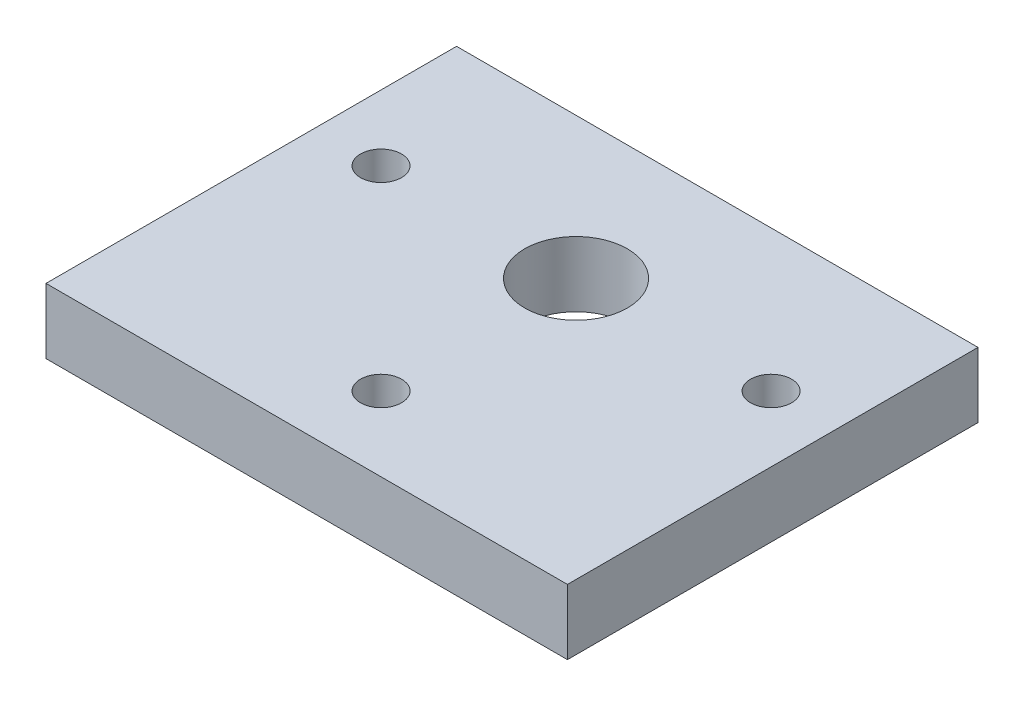
ISO-10303-21;
HEADER;
FILE_DESCRIPTION(('STEP AP214'),'2;1');
FILE_NAME('part.step','',(''),(''),'','','');
FILE_SCHEMA(('AUTOMOTIVE_DESIGN { 1 0 10303 214 1 1 1 1 }'));
ENDSEC;
DATA;
#1=APPLICATION_CONTEXT('core data for automotive mechanical design processes');
#2=APPLICATION_PROTOCOL_DEFINITION('international standard','automotive_design',2000,#1);
#3=PRODUCT_CONTEXT('',#1,'mechanical');
#4=PRODUCT('Part','Part','',(#3));
#5=PRODUCT_RELATED_PRODUCT_CATEGORY('part','',(#4));
#6=PRODUCT_DEFINITION_FORMATION('','',#4);
#7=PRODUCT_DEFINITION_CONTEXT('part definition',#1,'design');
#8=PRODUCT_DEFINITION('design','',#6,#7);
#9=PRODUCT_DEFINITION_SHAPE('','',#8);
#10=(LENGTH_UNIT() NAMED_UNIT(*) SI_UNIT(.MILLI.,.METRE.));
#11=(NAMED_UNIT(*) PLANE_ANGLE_UNIT() SI_UNIT($,.RADIAN.));
#12=(NAMED_UNIT(*) SI_UNIT($,.STERADIAN.) SOLID_ANGLE_UNIT());
#13=UNCERTAINTY_MEASURE_WITH_UNIT(LENGTH_MEASURE(1.E-05),#10,'distance_accuracy_value','');
#14=(GEOMETRIC_REPRESENTATION_CONTEXT(3) GLOBAL_UNCERTAINTY_ASSIGNED_CONTEXT((#13)) GLOBAL_UNIT_ASSIGNED_CONTEXT((#10,
#11,#12)) REPRESENTATION_CONTEXT('',''));
#15=CARTESIAN_POINT('',(0.,0.,0.));
#16=DIRECTION('',(0.,0.,1.));
#17=DIRECTION('',(1.,0.,0.));
#18=AXIS2_PLACEMENT_3D('',#15,#16,#17);
#19=CARTESIAN_POINT('',(25.4,6.35,-40.));
#20=DIRECTION('',(-1.,0.,0.));
#21=DIRECTION('',(0.,0.,1.));
#22=AXIS2_PLACEMENT_3D('',#19,#20,#21);
#23=PLANE('',#22);
#24=DIRECTION('',(0.,-1.,0.));
#25=VECTOR('',#24,1.);
#26=CARTESIAN_POINT('',(25.4,10.,-33.2265724491529));
#27=LINE('',#26,#25);
#28=CARTESIAN_POINT('',(25.4,6.35,-33.2265724491529));
#29=VERTEX_POINT('',#28);
#30=CARTESIAN_POINT('',(25.4,0.,-33.2265724491529));
#31=VERTEX_POINT('',#30);
#32=EDGE_CURVE('E49',#29,#31,#27,.T.);
#33=ORIENTED_EDGE('',*,*,#32,.F.);
#34=DIRECTION('',(0.,0.,-1.));
#35=VECTOR('',#34,1.);
#36=CARTESIAN_POINT('',(25.4,6.35,-40.));
#37=LINE('',#36,#35);
#38=CARTESIAN_POINT('',(25.4,6.35,6.77342755084709));
#39=VERTEX_POINT('',#38);
#40=EDGE_CURVE('E87',#39,#29,#37,.T.);
#41=ORIENTED_EDGE('',*,*,#40,.F.);
#42=DIRECTION('',(0.,1.,0.));
#43=VECTOR('',#42,1.);
#44=CARTESIAN_POINT('',(25.4,-3.65,6.77342755084709));
#45=LINE('',#44,#43);
#46=CARTESIAN_POINT('',(25.4,0.,6.77342755084709));
#47=VERTEX_POINT('',#46);
#48=EDGE_CURVE('E113',#47,#39,#45,.T.);
#49=ORIENTED_EDGE('',*,*,#48,.F.);
#50=DIRECTION('',(0.,0.,-1.));
#51=VECTOR('',#50,1.);
#52=CARTESIAN_POINT('',(25.4,0.,-40.));
#53=LINE('',#52,#51);
#54=EDGE_CURVE('E88',#47,#31,#53,.T.);
#55=ORIENTED_EDGE('',*,*,#54,.T.);
#56=EDGE_LOOP('',(#33,#41,#49,#55));
#57=FACE_BOUND('',#56,.T.);
#58=ADVANCED_FACE('F35',(#57),#23,.F.);
#59=CARTESIAN_POINT('',(-25.4,6.35,-40.));
#60=DIRECTION('',(1.,0.,0.));
#61=DIRECTION('',(0.,0.,-1.));
#62=AXIS2_PLACEMENT_3D('',#59,#60,#61);
#63=PLANE('',#62);
#64=DIRECTION('',(0.,-1.,0.));
#65=VECTOR('',#64,1.);
#66=CARTESIAN_POINT('',(-25.4,10.,-33.2265724491529));
#67=LINE('',#66,#65);
#68=CARTESIAN_POINT('',(-25.4,6.35,-33.2265724491529));
#69=VERTEX_POINT('',#68);
#70=CARTESIAN_POINT('',(-25.4,0.,-33.2265724491529));
#71=VERTEX_POINT('',#70);
#72=EDGE_CURVE('E76',#69,#71,#67,.T.);
#73=ORIENTED_EDGE('',*,*,#72,.T.);
#74=DIRECTION('',(0.,0.,1.));
#75=VECTOR('',#74,1.);
#76=CARTESIAN_POINT('',(-25.4,0.,-40.));
#77=LINE('',#76,#75);
#78=CARTESIAN_POINT('',(-25.4,0.,6.77342755084709));
#79=VERTEX_POINT('',#78);
#80=EDGE_CURVE('E57',#71,#79,#77,.T.);
#81=ORIENTED_EDGE('',*,*,#80,.T.);
#82=DIRECTION('',(0.,1.,0.));
#83=VECTOR('',#82,1.);
#84=CARTESIAN_POINT('',(-25.4,-3.65,6.77342755084709));
#85=LINE('',#84,#83);
#86=CARTESIAN_POINT('',(-25.4,6.35,6.77342755084709));
#87=VERTEX_POINT('',#86);
#88=EDGE_CURVE('E105',#79,#87,#85,.T.);
#89=ORIENTED_EDGE('',*,*,#88,.T.);
#90=DIRECTION('',(0.,0.,1.));
#91=VECTOR('',#90,1.);
#92=CARTESIAN_POINT('',(-25.4,6.35,-40.));
#93=LINE('',#92,#91);
#94=EDGE_CURVE('E42',#69,#87,#93,.T.);
#95=ORIENTED_EDGE('',*,*,#94,.F.);
#96=EDGE_LOOP('',(#73,#81,#89,#95));
#97=FACE_BOUND('',#96,.T.);
#98=ADVANCED_FACE('F84',(#97),#63,.F.);
#99=CARTESIAN_POINT('',(0.,6.35,0.));
#100=DIRECTION('',(0.,1.,0.));
#101=DIRECTION('',(0.,0.,1.));
#102=AXIS2_PLACEMENT_3D('',#99,#100,#101);
#103=PLANE('',#102);
#104=CARTESIAN_POINT('',(0.,6.35,-19.4660918494586));
#105=DIRECTION('',(0.,1.,0.));
#106=DIRECTION('',(0.,0.,1.));
#107=AXIS2_PLACEMENT_3D('',#104,#105,#106);
#108=CIRCLE('',#107,5.);
#109=CARTESIAN_POINT('',(0.,6.35,-14.4660918494586));
#110=VERTEX_POINT('',#109);
#111=EDGE_CURVE('E81',#110,#110,#108,.T.);
#112=ORIENTED_EDGE('',*,*,#111,.F.);
#113=EDGE_LOOP('',(#112));
#114=FACE_BOUND('',#113,.T.);
#115=CARTESIAN_POINT('',(19.,6.35,-19.4660918494586));
#116=DIRECTION('',(0.,1.,0.));
#117=DIRECTION('',(0.,0.,1.));
#118=AXIS2_PLACEMENT_3D('',#115,#116,#117);
#119=CIRCLE('',#118,2.);
#120=CARTESIAN_POINT('',(19.,6.35,-17.4660918494586));
#121=VERTEX_POINT('',#120);
#122=EDGE_CURVE('E108',#121,#121,#119,.T.);
#123=ORIENTED_EDGE('',*,*,#122,.F.);
#124=EDGE_LOOP('',(#123));
#125=FACE_BOUND('',#124,.T.);
#126=CARTESIAN_POINT('',(0.,6.35,-0.466091849458573));
#127=DIRECTION('',(0.,1.,0.));
#128=DIRECTION('',(0.,0.,1.));
#129=AXIS2_PLACEMENT_3D('',#126,#127,#128);
#130=CIRCLE('',#129,2.);
#131=CARTESIAN_POINT('',(0.,6.35,1.53390815054143));
#132=VERTEX_POINT('',#131);
#133=EDGE_CURVE('E101',#132,#132,#130,.T.);
#134=ORIENTED_EDGE('',*,*,#133,.F.);
#135=EDGE_LOOP('',(#134));
#136=FACE_BOUND('',#135,.T.);
#137=CARTESIAN_POINT('',(-19.,6.35,-19.4660918494586));
#138=DIRECTION('',(0.,1.,0.));
#139=DIRECTION('',(0.,0.,1.));
#140=AXIS2_PLACEMENT_3D('',#137,#138,#139);
#141=CIRCLE('',#140,2.);
#142=CARTESIAN_POINT('',(-19.,6.35,-17.4660918494586));
#143=VERTEX_POINT('',#142);
#144=EDGE_CURVE('E95',#143,#143,#141,.T.);
#145=ORIENTED_EDGE('',*,*,#144,.F.);
#146=EDGE_LOOP('',(#145));
#147=FACE_BOUND('',#146,.T.);
#148=ORIENTED_EDGE('',*,*,#40,.T.);
#149=DIRECTION('',(-1.,0.,0.));
#150=VECTOR('',#149,1.);
#151=CARTESIAN_POINT('',(0.,6.35,-33.2265724491529));
#152=LINE('',#151,#150);
#153=EDGE_CURVE('E119',#29,#69,#152,.T.);
#154=ORIENTED_EDGE('',*,*,#153,.T.);
#155=ORIENTED_EDGE('',*,*,#94,.T.);
#156=DIRECTION('',(-1.,0.,0.));
#157=VECTOR('',#156,1.);
#158=CARTESIAN_POINT('',(-25.4,6.35,6.77342755084709));
#159=LINE('',#158,#157);
#160=EDGE_CURVE('E115',#39,#87,#159,.T.);
#161=ORIENTED_EDGE('',*,*,#160,.F.);
#162=EDGE_LOOP('',(#148,#154,#155,#161));
#163=FACE_BOUND('',#162,.T.);
#164=ADVANCED_FACE('F133',(#114,#125,#136,#147,#163),#103,.T.);
#165=CARTESIAN_POINT('',(0.,0.,0.));
#166=DIRECTION('',(0.,1.,0.));
#167=DIRECTION('',(0.,0.,1.));
#168=AXIS2_PLACEMENT_3D('',#165,#166,#167);
#169=PLANE('',#168);
#170=CARTESIAN_POINT('',(0.,0.,-19.4660918494586));
#171=DIRECTION('',(0.,-1.,0.));
#172=DIRECTION('',(0.,0.,-1.));
#173=AXIS2_PLACEMENT_3D('',#170,#171,#172);
#174=CIRCLE('',#173,5.);
#175=CARTESIAN_POINT('',(0.,0.,-24.4660918494586));
#176=VERTEX_POINT('',#175);
#177=EDGE_CURVE('E124',#176,#176,#174,.T.);
#178=ORIENTED_EDGE('',*,*,#177,.F.);
#179=EDGE_LOOP('',(#178));
#180=FACE_BOUND('',#179,.T.);
#181=CARTESIAN_POINT('',(-19.,0.,-19.4660918494586));
#182=DIRECTION('',(0.,1.,0.));
#183=DIRECTION('',(0.,0.,1.));
#184=AXIS2_PLACEMENT_3D('',#181,#182,#183);
#185=CIRCLE('',#184,2.);
#186=CARTESIAN_POINT('',(-19.,0.,-17.4660918494586));
#187=VERTEX_POINT('',#186);
#188=EDGE_CURVE('E91',#187,#187,#185,.T.);
#189=ORIENTED_EDGE('',*,*,#188,.T.);
#190=EDGE_LOOP('',(#189));
#191=FACE_BOUND('',#190,.T.);
#192=CARTESIAN_POINT('',(0.,0.,-0.466091849458573));
#193=DIRECTION('',(0.,1.,0.));
#194=DIRECTION('',(0.,0.,1.));
#195=AXIS2_PLACEMENT_3D('',#192,#193,#194);
#196=CIRCLE('',#195,2.);
#197=CARTESIAN_POINT('',(0.,0.,1.53390815054143));
#198=VERTEX_POINT('',#197);
#199=EDGE_CURVE('E104',#198,#198,#196,.T.);
#200=ORIENTED_EDGE('',*,*,#199,.T.);
#201=EDGE_LOOP('',(#200));
#202=FACE_BOUND('',#201,.T.);
#203=CARTESIAN_POINT('',(19.,0.,-19.4660918494586));
#204=DIRECTION('',(0.,1.,0.));
#205=DIRECTION('',(0.,0.,1.));
#206=AXIS2_PLACEMENT_3D('',#203,#204,#205);
#207=CIRCLE('',#206,2.);
#208=CARTESIAN_POINT('',(19.,0.,-17.4660918494586));
#209=VERTEX_POINT('',#208);
#210=EDGE_CURVE('E98',#209,#209,#207,.T.);
#211=ORIENTED_EDGE('',*,*,#210,.T.);
#212=EDGE_LOOP('',(#211));
#213=FACE_BOUND('',#212,.T.);
#214=DIRECTION('',(1.,0.,0.));
#215=VECTOR('',#214,1.);
#216=CARTESIAN_POINT('',(0.,0.,-33.2265724491529));
#217=LINE('',#216,#215);
#218=EDGE_CURVE('E74',#71,#31,#217,.T.);
#219=ORIENTED_EDGE('',*,*,#218,.T.);
#220=ORIENTED_EDGE('',*,*,#54,.F.);
#221=DIRECTION('',(-1.,0.,0.));
#222=VECTOR('',#221,1.);
#223=CARTESIAN_POINT('',(0.,0.,6.77342755084709));
#224=LINE('',#223,#222);
#225=EDGE_CURVE('E11',#47,#79,#224,.T.);
#226=ORIENTED_EDGE('',*,*,#225,.T.);
#227=ORIENTED_EDGE('',*,*,#80,.F.);
#228=EDGE_LOOP('',(#219,#220,#226,#227));
#229=FACE_BOUND('',#228,.T.);
#230=ADVANCED_FACE('F86',(#180,#191,#202,#213,#229),#169,.F.);
#231=CARTESIAN_POINT('',(-19.,0.,-19.4660918494586));
#232=DIRECTION('',(0.,1.,0.));
#233=DIRECTION('',(0.,0.,1.));
#234=AXIS2_PLACEMENT_3D('',#231,#232,#233);
#235=CYLINDRICAL_SURFACE('',#234,2.);
#236=ORIENTED_EDGE('',*,*,#188,.F.);
#237=EDGE_LOOP('',(#236));
#238=FACE_BOUND('',#237,.T.);
#239=ORIENTED_EDGE('',*,*,#144,.T.);
#240=EDGE_LOOP('',(#239));
#241=FACE_BOUND('',#240,.T.);
#242=ADVANCED_FACE('F132',(#238,#241),#235,.F.);
#243=CARTESIAN_POINT('',(0.,0.,-0.466091849458573));
#244=DIRECTION('',(0.,1.,0.));
#245=DIRECTION('',(0.,0.,1.));
#246=AXIS2_PLACEMENT_3D('',#243,#244,#245);
#247=CYLINDRICAL_SURFACE('',#246,2.);
#248=ORIENTED_EDGE('',*,*,#199,.F.);
#249=EDGE_LOOP('',(#248));
#250=FACE_BOUND('',#249,.T.);
#251=ORIENTED_EDGE('',*,*,#133,.T.);
#252=EDGE_LOOP('',(#251));
#253=FACE_BOUND('',#252,.T.);
#254=ADVANCED_FACE('F145',(#250,#253),#247,.F.);
#255=CARTESIAN_POINT('',(19.,0.,-19.4660918494586));
#256=DIRECTION('',(0.,1.,0.));
#257=DIRECTION('',(0.,0.,1.));
#258=AXIS2_PLACEMENT_3D('',#255,#256,#257);
#259=CYLINDRICAL_SURFACE('',#258,2.);
#260=ORIENTED_EDGE('',*,*,#210,.F.);
#261=EDGE_LOOP('',(#260));
#262=FACE_BOUND('',#261,.T.);
#263=ORIENTED_EDGE('',*,*,#122,.T.);
#264=EDGE_LOOP('',(#263));
#265=FACE_BOUND('',#264,.T.);
#266=ADVANCED_FACE('F141',(#262,#265),#259,.F.);
#267=CARTESIAN_POINT('',(-25.4,-3.65,6.77342755084709));
#268=DIRECTION('',(0.,0.,-1.));
#269=DIRECTION('',(-1.,0.,0.));
#270=AXIS2_PLACEMENT_3D('',#267,#268,#269);
#271=PLANE('',#270);
#272=ORIENTED_EDGE('',*,*,#48,.T.);
#273=ORIENTED_EDGE('',*,*,#160,.T.);
#274=ORIENTED_EDGE('',*,*,#88,.F.);
#275=ORIENTED_EDGE('',*,*,#225,.F.);
#276=EDGE_LOOP('',(#272,#273,#274,#275));
#277=FACE_BOUND('',#276,.T.);
#278=ADVANCED_FACE('F144',(#277),#271,.F.);
#279=CARTESIAN_POINT('',(0.,10.,-33.2265724491529));
#280=DIRECTION('',(0.,0.,-1.));
#281=DIRECTION('',(-1.,0.,0.));
#282=AXIS2_PLACEMENT_3D('',#279,#280,#281);
#283=PLANE('',#282);
#284=ORIENTED_EDGE('',*,*,#32,.T.);
#285=ORIENTED_EDGE('',*,*,#218,.F.);
#286=ORIENTED_EDGE('',*,*,#72,.F.);
#287=ORIENTED_EDGE('',*,*,#153,.F.);
#288=EDGE_LOOP('',(#284,#285,#286,#287));
#289=FACE_BOUND('',#288,.T.);
#290=ADVANCED_FACE('F75',(#289),#283,.T.);
#291=CARTESIAN_POINT('',(0.,10.,-19.4660918494586));
#292=DIRECTION('',(0.,-1.,0.));
#293=DIRECTION('',(0.,0.,-1.));
#294=AXIS2_PLACEMENT_3D('',#291,#292,#293);
#295=CYLINDRICAL_SURFACE('',#294,5.);
#296=ORIENTED_EDGE('',*,*,#111,.T.);
#297=EDGE_LOOP('',(#296));
#298=FACE_BOUND('',#297,.T.);
#299=ORIENTED_EDGE('',*,*,#177,.T.);
#300=EDGE_LOOP('',(#299));
#301=FACE_BOUND('',#300,.T.);
#302=ADVANCED_FACE('F128',(#298,#301),#295,.F.);
#303=CLOSED_SHELL('',(#58,#98,#164,#230,#242,#254,#266,#278,#290,#302));
#304=MANIFOLD_SOLID_BREP('B2',#303);
#305=ADVANCED_BREP_SHAPE_REPRESENTATION('',(#18,#304),#14);
#306=SHAPE_DEFINITION_REPRESENTATION(#9,#305);
ENDSEC;
END-ISO-10303-21;
